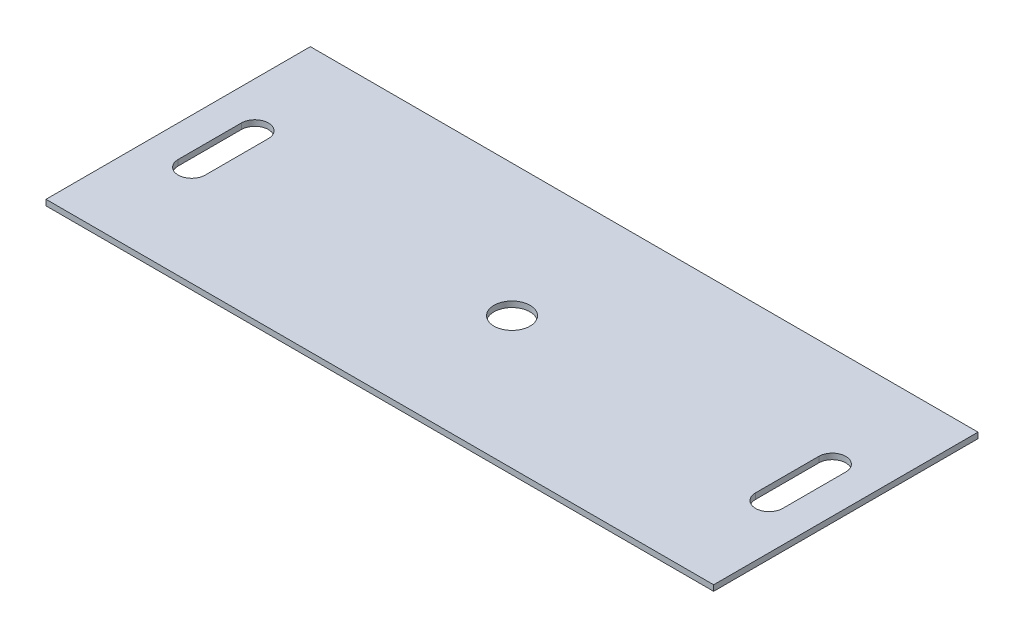
ISO-10303-21;
HEADER;
FILE_DESCRIPTION(('STEP AP214'),'2;1');
FILE_NAME('part.step','',(''),(''),'','','');
FILE_SCHEMA(('AUTOMOTIVE_DESIGN { 1 0 10303 214 1 1 1 1 }'));
ENDSEC;
DATA;
#1=APPLICATION_CONTEXT('core data for automotive mechanical design processes');
#2=APPLICATION_PROTOCOL_DEFINITION('international standard','automotive_design',2000,#1);
#3=PRODUCT_CONTEXT('',#1,'mechanical');
#4=PRODUCT('Part','Part','',(#3));
#5=PRODUCT_RELATED_PRODUCT_CATEGORY('part','',(#4));
#6=PRODUCT_DEFINITION_FORMATION('','',#4);
#7=PRODUCT_DEFINITION_CONTEXT('part definition',#1,'design');
#8=PRODUCT_DEFINITION('design','',#6,#7);
#9=PRODUCT_DEFINITION_SHAPE('','',#8);
#10=(LENGTH_UNIT() NAMED_UNIT(*) SI_UNIT(.MILLI.,.METRE.));
#11=(NAMED_UNIT(*) PLANE_ANGLE_UNIT() SI_UNIT($,.RADIAN.));
#12=(NAMED_UNIT(*) SI_UNIT($,.STERADIAN.) SOLID_ANGLE_UNIT());
#13=UNCERTAINTY_MEASURE_WITH_UNIT(LENGTH_MEASURE(1.E-05),#10,'distance_accuracy_value','');
#14=(GEOMETRIC_REPRESENTATION_CONTEXT(3) GLOBAL_UNCERTAINTY_ASSIGNED_CONTEXT((#13)) GLOBAL_UNIT_ASSIGNED_CONTEXT((#10,
#11,#12)) REPRESENTATION_CONTEXT('',''));
#15=CARTESIAN_POINT('',(0.,0.,0.));
#16=DIRECTION('',(0.,0.,1.));
#17=DIRECTION('',(1.,0.,0.));
#18=AXIS2_PLACEMENT_3D('',#15,#16,#17);
#19=CARTESIAN_POINT('',(370.,6.35,146.5));
#20=DIRECTION('',(-1.,0.,0.));
#21=DIRECTION('',(0.,0.,1.));
#22=AXIS2_PLACEMENT_3D('',#19,#20,#21);
#23=PLANE('',#22);
#24=DIRECTION('',(0.,0.,-1.));
#25=VECTOR('',#24,1.);
#26=CARTESIAN_POINT('',(370.,0.,146.5));
#27=LINE('',#26,#25);
#28=CARTESIAN_POINT('',(370.,0.,146.5));
#29=VERTEX_POINT('',#28);
#30=CARTESIAN_POINT('',(370.,0.,-146.5));
#31=VERTEX_POINT('',#30);
#32=EDGE_CURVE('E165',#29,#31,#27,.T.);
#33=ORIENTED_EDGE('',*,*,#32,.T.);
#34=DIRECTION('',(0.,-1.,0.));
#35=VECTOR('',#34,1.);
#36=CARTESIAN_POINT('',(370.,6.35,-146.5));
#37=LINE('',#36,#35);
#38=CARTESIAN_POINT('',(370.,6.35,-146.5));
#39=VERTEX_POINT('',#38);
#40=EDGE_CURVE('E11',#39,#31,#37,.T.);
#41=ORIENTED_EDGE('',*,*,#40,.F.);
#42=DIRECTION('',(0.,0.,-1.));
#43=VECTOR('',#42,1.);
#44=CARTESIAN_POINT('',(370.,6.35,146.5));
#45=LINE('',#44,#43);
#46=CARTESIAN_POINT('',(370.,6.35,146.5));
#47=VERTEX_POINT('',#46);
#48=EDGE_CURVE('E200',#47,#39,#45,.T.);
#49=ORIENTED_EDGE('',*,*,#48,.F.);
#50=DIRECTION('',(0.,-1.,0.));
#51=VECTOR('',#50,1.);
#52=CARTESIAN_POINT('',(370.,6.35,146.5));
#53=LINE('',#52,#51);
#54=EDGE_CURVE('E210',#47,#29,#53,.T.);
#55=ORIENTED_EDGE('',*,*,#54,.T.);
#56=EDGE_LOOP('',(#33,#41,#49,#55));
#57=FACE_BOUND('',#56,.T.);
#58=ADVANCED_FACE('F38',(#57),#23,.F.);
#59=CARTESIAN_POINT('',(-370.,6.35,-146.5));
#60=DIRECTION('',(0.,0.,1.));
#61=DIRECTION('',(1.,0.,0.));
#62=AXIS2_PLACEMENT_3D('',#59,#60,#61);
#63=PLANE('',#62);
#64=DIRECTION('',(-1.,0.,0.));
#65=VECTOR('',#64,1.);
#66=CARTESIAN_POINT('',(-370.,0.,-146.5));
#67=LINE('',#66,#65);
#68=CARTESIAN_POINT('',(-370.,0.,-146.5));
#69=VERTEX_POINT('',#68);
#70=EDGE_CURVE('E213',#31,#69,#67,.T.);
#71=ORIENTED_EDGE('',*,*,#70,.T.);
#72=DIRECTION('',(0.,-1.,0.));
#73=VECTOR('',#72,1.);
#74=CARTESIAN_POINT('',(-370.,6.35,-146.5));
#75=LINE('',#74,#73);
#76=CARTESIAN_POINT('',(-370.,6.35,-146.5));
#77=VERTEX_POINT('',#76);
#78=EDGE_CURVE('E45',#77,#69,#75,.T.);
#79=ORIENTED_EDGE('',*,*,#78,.F.);
#80=DIRECTION('',(-1.,0.,0.));
#81=VECTOR('',#80,1.);
#82=CARTESIAN_POINT('',(-370.,6.35,-146.5));
#83=LINE('',#82,#81);
#84=EDGE_CURVE('E203',#39,#77,#83,.T.);
#85=ORIENTED_EDGE('',*,*,#84,.F.);
#86=ORIENTED_EDGE('',*,*,#40,.T.);
#87=EDGE_LOOP('',(#71,#79,#85,#86));
#88=FACE_BOUND('',#87,.T.);
#89=ADVANCED_FACE('F242',(#88),#63,.F.);
#90=CARTESIAN_POINT('',(-370.,6.35,146.5));
#91=DIRECTION('',(1.,0.,0.));
#92=DIRECTION('',(0.,0.,-1.));
#93=AXIS2_PLACEMENT_3D('',#90,#91,#92);
#94=PLANE('',#93);
#95=DIRECTION('',(0.,0.,1.));
#96=VECTOR('',#95,1.);
#97=CARTESIAN_POINT('',(-370.,0.,146.5));
#98=LINE('',#97,#96);
#99=CARTESIAN_POINT('',(-370.,0.,146.5));
#100=VERTEX_POINT('',#99);
#101=EDGE_CURVE('E215',#69,#100,#98,.T.);
#102=ORIENTED_EDGE('',*,*,#101,.T.);
#103=DIRECTION('',(0.,-1.,0.));
#104=VECTOR('',#103,1.);
#105=CARTESIAN_POINT('',(-370.,6.35,146.5));
#106=LINE('',#105,#104);
#107=CARTESIAN_POINT('',(-370.,6.35,146.5));
#108=VERTEX_POINT('',#107);
#109=EDGE_CURVE('E220',#108,#100,#106,.T.);
#110=ORIENTED_EDGE('',*,*,#109,.F.);
#111=DIRECTION('',(0.,0.,1.));
#112=VECTOR('',#111,1.);
#113=CARTESIAN_POINT('',(-370.,6.35,146.5));
#114=LINE('',#113,#112);
#115=EDGE_CURVE('E206',#77,#108,#114,.T.);
#116=ORIENTED_EDGE('',*,*,#115,.F.);
#117=ORIENTED_EDGE('',*,*,#78,.T.);
#118=EDGE_LOOP('',(#102,#110,#116,#117));
#119=FACE_BOUND('',#118,.T.);
#120=ADVANCED_FACE('F227',(#119),#94,.F.);
#121=CARTESIAN_POINT('',(-370.,6.35,146.5));
#122=DIRECTION('',(0.,0.,-1.));
#123=DIRECTION('',(-1.,0.,0.));
#124=AXIS2_PLACEMENT_3D('',#121,#122,#123);
#125=PLANE('',#124);
#126=DIRECTION('',(1.,0.,0.));
#127=VECTOR('',#126,1.);
#128=CARTESIAN_POINT('',(-370.,0.,146.5));
#129=LINE('',#128,#127);
#130=EDGE_CURVE('E204',#100,#29,#129,.T.);
#131=ORIENTED_EDGE('',*,*,#130,.T.);
#132=ORIENTED_EDGE('',*,*,#54,.F.);
#133=DIRECTION('',(1.,0.,0.));
#134=VECTOR('',#133,1.);
#135=CARTESIAN_POINT('',(-370.,6.35,146.5));
#136=LINE('',#135,#134);
#137=EDGE_CURVE('E208',#108,#47,#136,.T.);
#138=ORIENTED_EDGE('',*,*,#137,.F.);
#139=ORIENTED_EDGE('',*,*,#109,.T.);
#140=EDGE_LOOP('',(#131,#132,#138,#139));
#141=FACE_BOUND('',#140,.T.);
#142=ADVANCED_FACE('F235',(#141),#125,.F.);
#143=CARTESIAN_POINT('',(0.,6.35,0.));
#144=DIRECTION('',(0.,-1.,0.));
#145=DIRECTION('',(0.,0.,-1.));
#146=AXIS2_PLACEMENT_3D('',#143,#144,#145);
#147=PLANE('',#146);
#148=CARTESIAN_POINT('',(0.,6.35,0.));
#149=DIRECTION('',(0.,1.,0.));
#150=DIRECTION('',(0.,0.,1.));
#151=AXIS2_PLACEMENT_3D('',#148,#149,#150);
#152=CIRCLE('',#151,20.);
#153=CARTESIAN_POINT('',(0.,6.35,20.));
#154=VERTEX_POINT('',#153);
#155=EDGE_CURVE('E153',#154,#154,#152,.T.);
#156=ORIENTED_EDGE('',*,*,#155,.F.);
#157=EDGE_LOOP('',(#156));
#158=FACE_BOUND('',#157,.T.);
#159=DIRECTION('',(0.,0.,-1.));
#160=VECTOR('',#159,1.);
#161=CARTESIAN_POINT('',(-305.,6.35,35.));
#162=LINE('',#161,#160);
#163=CARTESIAN_POINT('',(-305.,6.35,35.));
#164=VERTEX_POINT('',#163);
#165=CARTESIAN_POINT('',(-305.,6.35,-35.));
#166=VERTEX_POINT('',#165);
#167=EDGE_CURVE('E159',#164,#166,#162,.T.);
#168=ORIENTED_EDGE('',*,*,#167,.F.);
#169=CARTESIAN_POINT('',(-320.,6.35,35.));
#170=DIRECTION('',(0.,1.,0.));
#171=DIRECTION('',(0.,0.,1.));
#172=AXIS2_PLACEMENT_3D('',#169,#170,#171);
#173=CIRCLE('',#172,14.9999999999999);
#174=CARTESIAN_POINT('',(-335.,6.35,35.));
#175=VERTEX_POINT('',#174);
#176=EDGE_CURVE('E52',#175,#164,#173,.T.);
#177=ORIENTED_EDGE('',*,*,#176,.F.);
#178=DIRECTION('',(0.,0.,1.));
#179=VECTOR('',#178,1.);
#180=CARTESIAN_POINT('',(-335.,6.35,35.));
#181=LINE('',#180,#179);
#182=CARTESIAN_POINT('',(-335.,6.35,-35.));
#183=VERTEX_POINT('',#182);
#184=EDGE_CURVE('E147',#183,#175,#181,.T.);
#185=ORIENTED_EDGE('',*,*,#184,.F.);
#186=CARTESIAN_POINT('',(-320.,6.35,-35.));
#187=DIRECTION('',(0.,1.,0.));
#188=DIRECTION('',(0.,0.,1.));
#189=AXIS2_PLACEMENT_3D('',#186,#187,#188);
#190=CIRCLE('',#189,14.9999999999999);
#191=EDGE_CURVE('E150',#166,#183,#190,.T.);
#192=ORIENTED_EDGE('',*,*,#191,.F.);
#193=EDGE_LOOP('',(#168,#177,#185,#192));
#194=FACE_BOUND('',#193,.T.);
#195=DIRECTION('',(0.,0.,-1.));
#196=VECTOR('',#195,1.);
#197=CARTESIAN_POINT('',(335.,6.35,35.));
#198=LINE('',#197,#196);
#199=CARTESIAN_POINT('',(335.,6.35,35.));
#200=VERTEX_POINT('',#199);
#201=CARTESIAN_POINT('',(335.,6.35,-35.));
#202=VERTEX_POINT('',#201);
#203=EDGE_CURVE('E186',#200,#202,#198,.T.);
#204=ORIENTED_EDGE('',*,*,#203,.F.);
#205=CARTESIAN_POINT('',(320.,6.35,35.));
#206=DIRECTION('',(0.,1.,0.));
#207=DIRECTION('',(0.,0.,-1.));
#208=AXIS2_PLACEMENT_3D('',#205,#206,#207);
#209=CIRCLE('',#208,14.9999999999999);
#210=CARTESIAN_POINT('',(305.,6.35,35.));
#211=VERTEX_POINT('',#210);
#212=EDGE_CURVE('E60',#211,#200,#209,.T.);
#213=ORIENTED_EDGE('',*,*,#212,.F.);
#214=DIRECTION('',(0.,0.,1.));
#215=VECTOR('',#214,1.);
#216=CARTESIAN_POINT('',(305.,6.35,35.));
#217=LINE('',#216,#215);
#218=CARTESIAN_POINT('',(305.,6.35,-35.));
#219=VERTEX_POINT('',#218);
#220=EDGE_CURVE('E179',#219,#211,#217,.T.);
#221=ORIENTED_EDGE('',*,*,#220,.F.);
#222=CARTESIAN_POINT('',(320.,6.35,-35.));
#223=DIRECTION('',(0.,1.,0.));
#224=DIRECTION('',(0.,0.,-1.));
#225=AXIS2_PLACEMENT_3D('',#222,#223,#224);
#226=CIRCLE('',#225,14.9999999999999);
#227=EDGE_CURVE('E182',#202,#219,#226,.T.);
#228=ORIENTED_EDGE('',*,*,#227,.F.);
#229=EDGE_LOOP('',(#204,#213,#221,#228));
#230=FACE_BOUND('',#229,.T.);
#231=ORIENTED_EDGE('',*,*,#48,.T.);
#232=ORIENTED_EDGE('',*,*,#84,.T.);
#233=ORIENTED_EDGE('',*,*,#115,.T.);
#234=ORIENTED_EDGE('',*,*,#137,.T.);
#235=EDGE_LOOP('',(#231,#232,#233,#234));
#236=FACE_BOUND('',#235,.T.);
#237=ADVANCED_FACE('F241',(#158,#194,#230,#236),#147,.F.);
#238=CARTESIAN_POINT('',(0.,0.,0.));
#239=DIRECTION('',(0.,-1.,0.));
#240=DIRECTION('',(0.,0.,-1.));
#241=AXIS2_PLACEMENT_3D('',#238,#239,#240);
#242=PLANE('',#241);
#243=CARTESIAN_POINT('',(0.,0.,0.));
#244=DIRECTION('',(0.,1.,0.));
#245=DIRECTION('',(0.,0.,1.));
#246=AXIS2_PLACEMENT_3D('',#243,#244,#245);
#247=CIRCLE('',#246,20.);
#248=CARTESIAN_POINT('',(0.,0.,20.));
#249=VERTEX_POINT('',#248);
#250=EDGE_CURVE('E178',#249,#249,#247,.T.);
#251=ORIENTED_EDGE('',*,*,#250,.T.);
#252=EDGE_LOOP('',(#251));
#253=FACE_BOUND('',#252,.T.);
#254=CARTESIAN_POINT('',(-320.,0.,35.));
#255=DIRECTION('',(0.,1.,0.));
#256=DIRECTION('',(0.,0.,1.));
#257=AXIS2_PLACEMENT_3D('',#254,#255,#256);
#258=CIRCLE('',#257,14.9999999999999);
#259=CARTESIAN_POINT('',(-335.,0.,35.));
#260=VERTEX_POINT('',#259);
#261=CARTESIAN_POINT('',(-305.,0.,35.));
#262=VERTEX_POINT('',#261);
#263=EDGE_CURVE('E128',#260,#262,#258,.T.);
#264=ORIENTED_EDGE('',*,*,#263,.T.);
#265=DIRECTION('',(0.,0.,-1.));
#266=VECTOR('',#265,1.);
#267=CARTESIAN_POINT('',(-305.,0.,35.));
#268=LINE('',#267,#266);
#269=CARTESIAN_POINT('',(-305.,0.,-35.));
#270=VERTEX_POINT('',#269);
#271=EDGE_CURVE('E138',#262,#270,#268,.T.);
#272=ORIENTED_EDGE('',*,*,#271,.T.);
#273=CARTESIAN_POINT('',(-320.,0.,-35.));
#274=DIRECTION('',(0.,1.,0.));
#275=DIRECTION('',(0.,0.,1.));
#276=AXIS2_PLACEMENT_3D('',#273,#274,#275);
#277=CIRCLE('',#276,14.9999999999999);
#278=CARTESIAN_POINT('',(-335.,0.,-35.));
#279=VERTEX_POINT('',#278);
#280=EDGE_CURVE('E142',#270,#279,#277,.T.);
#281=ORIENTED_EDGE('',*,*,#280,.T.);
#282=DIRECTION('',(0.,0.,1.));
#283=VECTOR('',#282,1.);
#284=CARTESIAN_POINT('',(-335.,0.,35.));
#285=LINE('',#284,#283);
#286=EDGE_CURVE('E134',#279,#260,#285,.T.);
#287=ORIENTED_EDGE('',*,*,#286,.T.);
#288=EDGE_LOOP('',(#264,#272,#281,#287));
#289=FACE_BOUND('',#288,.T.);
#290=CARTESIAN_POINT('',(320.,0.,35.));
#291=DIRECTION('',(0.,1.,0.));
#292=DIRECTION('',(0.,0.,-1.));
#293=AXIS2_PLACEMENT_3D('',#290,#291,#292);
#294=CIRCLE('',#293,14.9999999999999);
#295=CARTESIAN_POINT('',(305.,0.,35.));
#296=VERTEX_POINT('',#295);
#297=CARTESIAN_POINT('',(335.,0.,35.));
#298=VERTEX_POINT('',#297);
#299=EDGE_CURVE('E183',#296,#298,#294,.T.);
#300=ORIENTED_EDGE('',*,*,#299,.T.);
#301=DIRECTION('',(0.,0.,-1.));
#302=VECTOR('',#301,1.);
#303=CARTESIAN_POINT('',(335.,0.,35.));
#304=LINE('',#303,#302);
#305=CARTESIAN_POINT('',(335.,0.,-35.));
#306=VERTEX_POINT('',#305);
#307=EDGE_CURVE('E195',#298,#306,#304,.T.);
#308=ORIENTED_EDGE('',*,*,#307,.T.);
#309=CARTESIAN_POINT('',(320.,0.,-35.));
#310=DIRECTION('',(0.,1.,0.));
#311=DIRECTION('',(0.,0.,-1.));
#312=AXIS2_PLACEMENT_3D('',#309,#310,#311);
#313=CIRCLE('',#312,14.9999999999999);
#314=CARTESIAN_POINT('',(305.,0.,-35.));
#315=VERTEX_POINT('',#314);
#316=EDGE_CURVE('E192',#306,#315,#313,.T.);
#317=ORIENTED_EDGE('',*,*,#316,.T.);
#318=DIRECTION('',(0.,0.,1.));
#319=VECTOR('',#318,1.);
#320=CARTESIAN_POINT('',(305.,0.,35.));
#321=LINE('',#320,#319);
#322=EDGE_CURVE('E171',#315,#296,#321,.T.);
#323=ORIENTED_EDGE('',*,*,#322,.T.);
#324=EDGE_LOOP('',(#300,#308,#317,#323));
#325=FACE_BOUND('',#324,.T.);
#326=ORIENTED_EDGE('',*,*,#32,.F.);
#327=ORIENTED_EDGE('',*,*,#130,.F.);
#328=ORIENTED_EDGE('',*,*,#101,.F.);
#329=ORIENTED_EDGE('',*,*,#70,.F.);
#330=EDGE_LOOP('',(#326,#327,#328,#329));
#331=FACE_BOUND('',#330,.T.);
#332=ADVANCED_FACE('F144',(#253,#289,#325,#331),#242,.T.);
#333=CARTESIAN_POINT('',(320.,0.,35.));
#334=DIRECTION('',(0.,1.,0.));
#335=DIRECTION('',(0.,0.,1.));
#336=AXIS2_PLACEMENT_3D('',#333,#334,#335);
#337=CYLINDRICAL_SURFACE('',#336,14.9999999999999);
#338=ORIENTED_EDGE('',*,*,#212,.T.);
#339=DIRECTION('',(0.,1.,0.));
#340=VECTOR('',#339,1.);
#341=CARTESIAN_POINT('',(335.,0.,35.));
#342=LINE('',#341,#340);
#343=EDGE_CURVE('E169',#298,#200,#342,.T.);
#344=ORIENTED_EDGE('',*,*,#343,.F.);
#345=ORIENTED_EDGE('',*,*,#299,.F.);
#346=DIRECTION('',(0.,1.,0.));
#347=VECTOR('',#346,1.);
#348=CARTESIAN_POINT('',(305.,0.,35.));
#349=LINE('',#348,#347);
#350=EDGE_CURVE('E176',#296,#211,#349,.T.);
#351=ORIENTED_EDGE('',*,*,#350,.T.);
#352=EDGE_LOOP('',(#338,#344,#345,#351));
#353=FACE_BOUND('',#352,.T.);
#354=ADVANCED_FACE('F254',(#353),#337,.F.);
#355=CARTESIAN_POINT('',(305.,0.,35.));
#356=DIRECTION('',(-1.,0.,0.));
#357=DIRECTION('',(0.,0.,1.));
#358=AXIS2_PLACEMENT_3D('',#355,#356,#357);
#359=PLANE('',#358);
#360=ORIENTED_EDGE('',*,*,#220,.T.);
#361=ORIENTED_EDGE('',*,*,#350,.F.);
#362=ORIENTED_EDGE('',*,*,#322,.F.);
#363=DIRECTION('',(0.,1.,0.));
#364=VECTOR('',#363,1.);
#365=CARTESIAN_POINT('',(305.,0.,-35.));
#366=LINE('',#365,#364);
#367=EDGE_CURVE('E174',#315,#219,#366,.T.);
#368=ORIENTED_EDGE('',*,*,#367,.T.);
#369=EDGE_LOOP('',(#360,#361,#362,#368));
#370=FACE_BOUND('',#369,.T.);
#371=ADVANCED_FACE('F259',(#370),#359,.F.);
#372=CARTESIAN_POINT('',(320.,0.,-35.));
#373=DIRECTION('',(0.,1.,0.));
#374=DIRECTION('',(0.,0.,1.));
#375=AXIS2_PLACEMENT_3D('',#372,#373,#374);
#376=CYLINDRICAL_SURFACE('',#375,14.9999999999999);
#377=ORIENTED_EDGE('',*,*,#227,.T.);
#378=ORIENTED_EDGE('',*,*,#367,.F.);
#379=ORIENTED_EDGE('',*,*,#316,.F.);
#380=DIRECTION('',(0.,1.,0.));
#381=VECTOR('',#380,1.);
#382=CARTESIAN_POINT('',(335.,0.,-35.));
#383=LINE('',#382,#381);
#384=EDGE_CURVE('E172',#306,#202,#383,.T.);
#385=ORIENTED_EDGE('',*,*,#384,.T.);
#386=EDGE_LOOP('',(#377,#378,#379,#385));
#387=FACE_BOUND('',#386,.T.);
#388=ADVANCED_FACE('F262',(#387),#376,.F.);
#389=CARTESIAN_POINT('',(335.,0.,35.));
#390=DIRECTION('',(1.,0.,0.));
#391=DIRECTION('',(0.,0.,-1.));
#392=AXIS2_PLACEMENT_3D('',#389,#390,#391);
#393=PLANE('',#392);
#394=ORIENTED_EDGE('',*,*,#203,.T.);
#395=ORIENTED_EDGE('',*,*,#384,.F.);
#396=ORIENTED_EDGE('',*,*,#307,.F.);
#397=ORIENTED_EDGE('',*,*,#343,.T.);
#398=EDGE_LOOP('',(#394,#395,#396,#397));
#399=FACE_BOUND('',#398,.T.);
#400=ADVANCED_FACE('F266',(#399),#393,.F.);
#401=CARTESIAN_POINT('',(-320.,0.,35.));
#402=DIRECTION('',(0.,1.,0.));
#403=DIRECTION('',(0.,0.,1.));
#404=AXIS2_PLACEMENT_3D('',#401,#402,#403);
#405=CYLINDRICAL_SURFACE('',#404,14.9999999999999);
#406=ORIENTED_EDGE('',*,*,#176,.T.);
#407=DIRECTION('',(0.,1.,0.));
#408=VECTOR('',#407,1.);
#409=CARTESIAN_POINT('',(-305.,0.,35.));
#410=LINE('',#409,#408);
#411=EDGE_CURVE('E124',#262,#164,#410,.T.);
#412=ORIENTED_EDGE('',*,*,#411,.F.);
#413=ORIENTED_EDGE('',*,*,#263,.F.);
#414=DIRECTION('',(0.,1.,0.));
#415=VECTOR('',#414,1.);
#416=CARTESIAN_POINT('',(-335.,0.,35.));
#417=LINE('',#416,#415);
#418=EDGE_CURVE('E163',#260,#175,#417,.T.);
#419=ORIENTED_EDGE('',*,*,#418,.T.);
#420=EDGE_LOOP('',(#406,#412,#413,#419));
#421=FACE_BOUND('',#420,.T.);
#422=ADVANCED_FACE('F126',(#421),#405,.F.);
#423=CARTESIAN_POINT('',(-335.,0.,35.));
#424=DIRECTION('',(-1.,0.,0.));
#425=DIRECTION('',(0.,0.,1.));
#426=AXIS2_PLACEMENT_3D('',#423,#424,#425);
#427=PLANE('',#426);
#428=ORIENTED_EDGE('',*,*,#184,.T.);
#429=ORIENTED_EDGE('',*,*,#418,.F.);
#430=ORIENTED_EDGE('',*,*,#286,.F.);
#431=DIRECTION('',(0.,1.,0.));
#432=VECTOR('',#431,1.);
#433=CARTESIAN_POINT('',(-335.,0.,-35.));
#434=LINE('',#433,#432);
#435=EDGE_CURVE('E166',#279,#183,#434,.T.);
#436=ORIENTED_EDGE('',*,*,#435,.T.);
#437=EDGE_LOOP('',(#428,#429,#430,#436));
#438=FACE_BOUND('',#437,.T.);
#439=ADVANCED_FACE('F275',(#438),#427,.F.);
#440=CARTESIAN_POINT('',(-320.,0.,-35.));
#441=DIRECTION('',(0.,1.,0.));
#442=DIRECTION('',(0.,0.,1.));
#443=AXIS2_PLACEMENT_3D('',#440,#441,#442);
#444=CYLINDRICAL_SURFACE('',#443,14.9999999999999);
#445=ORIENTED_EDGE('',*,*,#191,.T.);
#446=ORIENTED_EDGE('',*,*,#435,.F.);
#447=ORIENTED_EDGE('',*,*,#280,.F.);
#448=DIRECTION('',(0.,1.,0.));
#449=VECTOR('',#448,1.);
#450=CARTESIAN_POINT('',(-305.,0.,-35.));
#451=LINE('',#450,#449);
#452=EDGE_CURVE('E133',#270,#166,#451,.T.);
#453=ORIENTED_EDGE('',*,*,#452,.T.);
#454=EDGE_LOOP('',(#445,#446,#447,#453));
#455=FACE_BOUND('',#454,.T.);
#456=ADVANCED_FACE('F279',(#455),#444,.F.);
#457=CARTESIAN_POINT('',(-305.,0.,35.));
#458=DIRECTION('',(1.,0.,0.));
#459=DIRECTION('',(0.,0.,-1.));
#460=AXIS2_PLACEMENT_3D('',#457,#458,#459);
#461=PLANE('',#460);
#462=ORIENTED_EDGE('',*,*,#167,.T.);
#463=ORIENTED_EDGE('',*,*,#452,.F.);
#464=ORIENTED_EDGE('',*,*,#271,.F.);
#465=ORIENTED_EDGE('',*,*,#411,.T.);
#466=EDGE_LOOP('',(#462,#463,#464,#465));
#467=FACE_BOUND('',#466,.T.);
#468=ADVANCED_FACE('F139',(#467),#461,.F.);
#469=CARTESIAN_POINT('',(0.,0.,0.));
#470=DIRECTION('',(0.,1.,0.));
#471=DIRECTION('',(0.,0.,1.));
#472=AXIS2_PLACEMENT_3D('',#469,#470,#471);
#473=CYLINDRICAL_SURFACE('',#472,20.);
#474=ORIENTED_EDGE('',*,*,#250,.F.);
#475=EDGE_LOOP('',(#474));
#476=FACE_BOUND('',#475,.T.);
#477=ORIENTED_EDGE('',*,*,#155,.T.);
#478=EDGE_LOOP('',(#477));
#479=FACE_BOUND('',#478,.T.);
#480=ADVANCED_FACE('F278',(#476,#479),#473,.F.);
#481=CLOSED_SHELL('',(#58,#89,#120,#142,#237,#332,#354,#371,#388,#400,#422,#439,#456,#468,#480));
#482=MANIFOLD_SOLID_BREP('B2',#481);
#483=ADVANCED_BREP_SHAPE_REPRESENTATION('',(#18,#482),#14);
#484=SHAPE_DEFINITION_REPRESENTATION(#9,#483);
ENDSEC;
END-ISO-10303-21;
